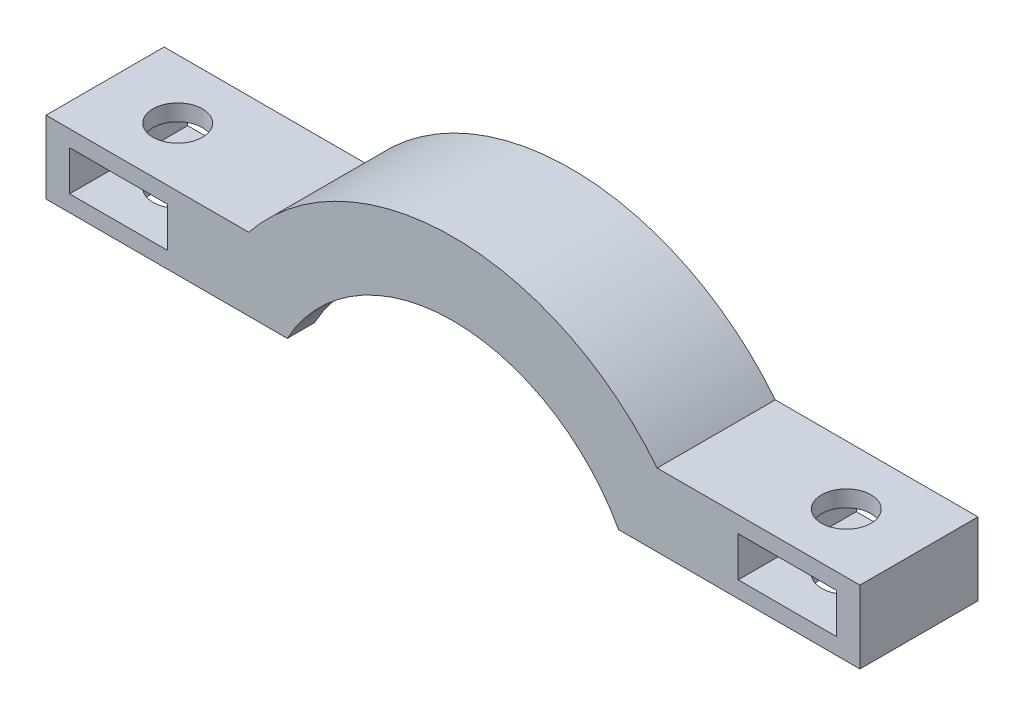
ISO-10303-21;
HEADER;
FILE_DESCRIPTION(('STEP AP214'),'2;1');
FILE_NAME('part.step','',(''),(''),'','','');
FILE_SCHEMA(('AUTOMOTIVE_DESIGN { 1 0 10303 214 1 1 1 1 }'));
ENDSEC;
DATA;
#1=APPLICATION_CONTEXT('core data for automotive mechanical design processes');
#2=APPLICATION_PROTOCOL_DEFINITION('international standard','automotive_design',2000,#1);
#3=PRODUCT_CONTEXT('',#1,'mechanical');
#4=PRODUCT('Part','Part','',(#3));
#5=PRODUCT_RELATED_PRODUCT_CATEGORY('part','',(#4));
#6=PRODUCT_DEFINITION_FORMATION('','',#4);
#7=PRODUCT_DEFINITION_CONTEXT('part definition',#1,'design');
#8=PRODUCT_DEFINITION('design','',#6,#7);
#9=PRODUCT_DEFINITION_SHAPE('','',#8);
#10=(LENGTH_UNIT() NAMED_UNIT(*) SI_UNIT(.MILLI.,.METRE.));
#11=(NAMED_UNIT(*) PLANE_ANGLE_UNIT() SI_UNIT($,.RADIAN.));
#12=(NAMED_UNIT(*) SI_UNIT($,.STERADIAN.) SOLID_ANGLE_UNIT());
#13=UNCERTAINTY_MEASURE_WITH_UNIT(LENGTH_MEASURE(1.E-05),#10,'distance_accuracy_value','');
#14=(GEOMETRIC_REPRESENTATION_CONTEXT(3) GLOBAL_UNCERTAINTY_ASSIGNED_CONTEXT((#13)) GLOBAL_UNIT_ASSIGNED_CONTEXT((#10,
#11,#12)) REPRESENTATION_CONTEXT('',''));
#15=CARTESIAN_POINT('',(0.,0.,0.));
#16=DIRECTION('',(0.,0.,1.));
#17=DIRECTION('',(1.,0.,0.));
#18=AXIS2_PLACEMENT_3D('',#15,#16,#17);
#19=CARTESIAN_POINT('',(0.,0.,15.748));
#20=DIRECTION('',(0.,0.,1.));
#21=DIRECTION('',(1.,0.,0.));
#22=AXIS2_PLACEMENT_3D('',#19,#20,#21);
#23=PLANE('',#22);
#24=DIRECTION('',(1.,0.,0.));
#25=VECTOR('',#24,1.);
#26=CARTESIAN_POINT('',(19.939,10.287,15.748));
#27=LINE('',#26,#25);
#28=CARTESIAN_POINT('',(19.939,10.287,15.748));
#29=VERTEX_POINT('',#28);
#30=CARTESIAN_POINT('',(26.797,10.287,15.748));
#31=VERTEX_POINT('',#30);
#32=EDGE_CURVE('E351',#29,#31,#27,.T.);
#33=ORIENTED_EDGE('',*,*,#32,.T.);
#34=DIRECTION('',(0.,-1.,0.));
#35=VECTOR('',#34,1.);
#36=CARTESIAN_POINT('',(26.797,10.287,15.748));
#37=LINE('',#36,#35);
#38=CARTESIAN_POINT('',(26.797,7.493,15.748));
#39=VERTEX_POINT('',#38);
#40=EDGE_CURVE('E348',#31,#39,#37,.T.);
#41=ORIENTED_EDGE('',*,*,#40,.T.);
#42=DIRECTION('',(-1.,0.,0.));
#43=VECTOR('',#42,1.);
#44=CARTESIAN_POINT('',(19.939,7.493,15.748));
#45=LINE('',#44,#43);
#46=CARTESIAN_POINT('',(19.939,7.493,15.748));
#47=VERTEX_POINT('',#46);
#48=EDGE_CURVE('E357',#39,#47,#45,.T.);
#49=ORIENTED_EDGE('',*,*,#48,.T.);
#50=DIRECTION('',(0.,1.,0.));
#51=VECTOR('',#50,1.);
#52=CARTESIAN_POINT('',(19.939,10.287,15.748));
#53=LINE('',#52,#51);
#54=EDGE_CURVE('E354',#47,#29,#53,.T.);
#55=ORIENTED_EDGE('',*,*,#54,.T.);
#56=EDGE_LOOP('',(#33,#41,#49,#55));
#57=FACE_BOUND('',#56,.T.);
#58=DIRECTION('',(0.,-1.,0.));
#59=VECTOR('',#58,1.);
#60=CARTESIAN_POINT('',(-26.797,10.287,15.748));
#61=LINE('',#60,#59);
#62=CARTESIAN_POINT('',(-26.797,10.287,15.748));
#63=VERTEX_POINT('',#62);
#64=CARTESIAN_POINT('',(-26.797,7.493,15.748));
#65=VERTEX_POINT('',#64);
#66=EDGE_CURVE('E305',#63,#65,#61,.T.);
#67=ORIENTED_EDGE('',*,*,#66,.F.);
#68=DIRECTION('',(-1.,0.,0.));
#69=VECTOR('',#68,1.);
#70=CARTESIAN_POINT('',(-19.939,10.287,15.748));
#71=LINE('',#70,#69);
#72=CARTESIAN_POINT('',(-19.939,10.287,15.748));
#73=VERTEX_POINT('',#72);
#74=EDGE_CURVE('E313',#73,#63,#71,.T.);
#75=ORIENTED_EDGE('',*,*,#74,.F.);
#76=DIRECTION('',(0.,1.,0.));
#77=VECTOR('',#76,1.);
#78=CARTESIAN_POINT('',(-19.939,10.287,15.748));
#79=LINE('',#78,#77);
#80=CARTESIAN_POINT('',(-19.939,7.493,15.748));
#81=VERTEX_POINT('',#80);
#82=EDGE_CURVE('E310',#81,#73,#79,.T.);
#83=ORIENTED_EDGE('',*,*,#82,.F.);
#84=DIRECTION('',(1.,0.,0.));
#85=VECTOR('',#84,1.);
#86=CARTESIAN_POINT('',(-19.939,7.493,15.748));
#87=LINE('',#86,#85);
#88=EDGE_CURVE('E307',#65,#81,#87,.T.);
#89=ORIENTED_EDGE('',*,*,#88,.F.);
#90=EDGE_LOOP('',(#67,#75,#83,#89));
#91=FACE_BOUND('',#90,.T.);
#92=DIRECTION('',(1.,0.,0.));
#93=VECTOR('',#92,1.);
#94=CARTESIAN_POINT('',(-28.448,6.35,15.748));
#95=LINE('',#94,#93);
#96=CARTESIAN_POINT('',(-28.448,6.35,15.748));
#97=VERTEX_POINT('',#96);
#98=CARTESIAN_POINT('',(-11.5813973250208,6.35,15.748));
#99=VERTEX_POINT('',#98);
#100=EDGE_CURVE('E191',#97,#99,#95,.T.);
#101=ORIENTED_EDGE('',*,*,#100,.T.);
#102=CARTESIAN_POINT('',(0.,0.,15.748));
#103=DIRECTION('',(0.,0.,1.));
#104=DIRECTION('',(1.,0.,0.));
#105=AXIS2_PLACEMENT_3D('',#102,#103,#104);
#106=CIRCLE('',#105,13.208);
#107=CARTESIAN_POINT('',(11.5813973250208,6.35,15.748));
#108=VERTEX_POINT('',#107);
#109=EDGE_CURVE('E212',#99,#108,#106,.F.);
#110=ORIENTED_EDGE('',*,*,#109,.T.);
#111=DIRECTION('',(-1.,0.,0.));
#112=VECTOR('',#111,1.);
#113=CARTESIAN_POINT('',(28.448,6.35,15.748));
#114=LINE('',#113,#112);
#115=CARTESIAN_POINT('',(28.448,6.35,15.748));
#116=VERTEX_POINT('',#115);
#117=EDGE_CURVE('E392',#116,#108,#114,.T.);
#118=ORIENTED_EDGE('',*,*,#117,.F.);
#119=DIRECTION('',(0.,-1.,0.));
#120=VECTOR('',#119,1.);
#121=CARTESIAN_POINT('',(28.448,11.43,15.748));
#122=LINE('',#121,#120);
#123=CARTESIAN_POINT('',(28.448,11.43,15.748));
#124=VERTEX_POINT('',#123);
#125=EDGE_CURVE('E376',#124,#116,#122,.T.);
#126=ORIENTED_EDGE('',*,*,#125,.F.);
#127=DIRECTION('',(-1.,0.,0.));
#128=VECTOR('',#127,1.);
#129=CARTESIAN_POINT('',(28.448,11.43,15.748));
#130=LINE('',#129,#128);
#131=CARTESIAN_POINT('',(14.2760654243387,11.43,15.748));
#132=VERTEX_POINT('',#131);
#133=EDGE_CURVE('E385',#124,#132,#130,.T.);
#134=ORIENTED_EDGE('',*,*,#133,.T.);
#135=CARTESIAN_POINT('',(0.,0.,15.748));
#136=DIRECTION('',(0.,0.,1.));
#137=DIRECTION('',(1.,0.,0.));
#138=AXIS2_PLACEMENT_3D('',#135,#136,#137);
#139=CIRCLE('',#138,18.288);
#140=CARTESIAN_POINT('',(-14.2760654243387,11.43,15.748));
#141=VERTEX_POINT('',#140);
#142=EDGE_CURVE('E208',#132,#141,#139,.T.);
#143=ORIENTED_EDGE('',*,*,#142,.T.);
#144=DIRECTION('',(1.,0.,0.));
#145=VECTOR('',#144,1.);
#146=CARTESIAN_POINT('',(-28.448,11.43,15.748));
#147=LINE('',#146,#145);
#148=CARTESIAN_POINT('',(-28.448,11.43,15.748));
#149=VERTEX_POINT('',#148);
#150=EDGE_CURVE('E346',#149,#141,#147,.T.);
#151=ORIENTED_EDGE('',*,*,#150,.F.);
#152=DIRECTION('',(0.,-1.,0.));
#153=VECTOR('',#152,1.);
#154=CARTESIAN_POINT('',(-28.448,11.43,15.748));
#155=LINE('',#154,#153);
#156=EDGE_CURVE('E334',#149,#97,#155,.T.);
#157=ORIENTED_EDGE('',*,*,#156,.T.);
#158=EDGE_LOOP('',(#101,#110,#118,#126,#134,#143,#151,#157));
#159=FACE_BOUND('',#158,.T.);
#160=ADVANCED_FACE('F39',(#57,#91,#159),#23,.T.);
#161=CARTESIAN_POINT('',(0.,0.,7.493));
#162=DIRECTION('',(0.,0.,1.));
#163=DIRECTION('',(1.,0.,0.));
#164=AXIS2_PLACEMENT_3D('',#161,#162,#163);
#165=PLANE('',#164);
#166=DIRECTION('',(0.,-1.,0.));
#167=VECTOR('',#166,1.);
#168=CARTESIAN_POINT('',(26.797,0.,7.493));
#169=LINE('',#168,#167);
#170=CARTESIAN_POINT('',(26.797,10.287,7.493));
#171=VERTEX_POINT('',#170);
#172=CARTESIAN_POINT('',(26.797,7.493,7.493));
#173=VERTEX_POINT('',#172);
#174=EDGE_CURVE('E236',#171,#173,#169,.T.);
#175=ORIENTED_EDGE('',*,*,#174,.F.);
#176=DIRECTION('',(1.,0.,0.));
#177=VECTOR('',#176,1.);
#178=CARTESIAN_POINT('',(0.,10.287,7.493));
#179=LINE('',#178,#177);
#180=CARTESIAN_POINT('',(19.939,10.287,7.493));
#181=VERTEX_POINT('',#180);
#182=EDGE_CURVE('E228',#181,#171,#179,.T.);
#183=ORIENTED_EDGE('',*,*,#182,.F.);
#184=DIRECTION('',(0.,1.,0.));
#185=VECTOR('',#184,1.);
#186=CARTESIAN_POINT('',(19.939,0.,7.493));
#187=LINE('',#186,#185);
#188=CARTESIAN_POINT('',(19.939,7.493,7.493));
#189=VERTEX_POINT('',#188);
#190=EDGE_CURVE('E219',#189,#181,#187,.T.);
#191=ORIENTED_EDGE('',*,*,#190,.F.);
#192=DIRECTION('',(-1.,0.,0.));
#193=VECTOR('',#192,1.);
#194=CARTESIAN_POINT('',(0.,7.493,7.493));
#195=LINE('',#194,#193);
#196=EDGE_CURVE('E233',#173,#189,#195,.T.);
#197=ORIENTED_EDGE('',*,*,#196,.F.);
#198=EDGE_LOOP('',(#175,#183,#191,#197));
#199=FACE_BOUND('',#198,.T.);
#200=DIRECTION('',(-1.,0.,0.));
#201=VECTOR('',#200,1.);
#202=CARTESIAN_POINT('',(0.,10.287,7.493));
#203=LINE('',#202,#201);
#204=CARTESIAN_POINT('',(-19.939,10.287,7.493));
#205=VERTEX_POINT('',#204);
#206=CARTESIAN_POINT('',(-26.797,10.287,7.493));
#207=VERTEX_POINT('',#206);
#208=EDGE_CURVE('E250',#205,#207,#203,.T.);
#209=ORIENTED_EDGE('',*,*,#208,.T.);
#210=DIRECTION('',(0.,-1.,0.));
#211=VECTOR('',#210,1.);
#212=CARTESIAN_POINT('',(-26.797,0.,7.493));
#213=LINE('',#212,#211);
#214=CARTESIAN_POINT('',(-26.797,7.493,7.493));
#215=VERTEX_POINT('',#214);
#216=EDGE_CURVE('E253',#207,#215,#213,.T.);
#217=ORIENTED_EDGE('',*,*,#216,.T.);
#218=DIRECTION('',(1.,0.,0.));
#219=VECTOR('',#218,1.);
#220=CARTESIAN_POINT('',(0.,7.493,7.493));
#221=LINE('',#220,#219);
#222=CARTESIAN_POINT('',(-19.939,7.493,7.493));
#223=VERTEX_POINT('',#222);
#224=EDGE_CURVE('E245',#215,#223,#221,.T.);
#225=ORIENTED_EDGE('',*,*,#224,.T.);
#226=DIRECTION('',(0.,1.,0.));
#227=VECTOR('',#226,1.);
#228=CARTESIAN_POINT('',(-19.939,0.,7.493));
#229=LINE('',#228,#227);
#230=EDGE_CURVE('E241',#223,#205,#229,.T.);
#231=ORIENTED_EDGE('',*,*,#230,.T.);
#232=EDGE_LOOP('',(#209,#217,#225,#231));
#233=FACE_BOUND('',#232,.T.);
#234=CARTESIAN_POINT('',(0.,0.,7.493));
#235=DIRECTION('',(0.,0.,1.));
#236=DIRECTION('',(1.,0.,0.));
#237=AXIS2_PLACEMENT_3D('',#234,#235,#236);
#238=CIRCLE('',#237,13.208);
#239=CARTESIAN_POINT('',(-11.5813973250208,6.35,7.493));
#240=VERTEX_POINT('',#239);
#241=CARTESIAN_POINT('',(11.5813973250208,6.35,7.493));
#242=VERTEX_POINT('',#241);
#243=EDGE_CURVE('E197',#240,#242,#238,.F.);
#244=ORIENTED_EDGE('',*,*,#243,.F.);
#245=DIRECTION('',(1.,0.,0.));
#246=VECTOR('',#245,1.);
#247=CARTESIAN_POINT('',(-28.448,6.35,7.493));
#248=LINE('',#247,#246);
#249=CARTESIAN_POINT('',(-28.448,6.35,7.493));
#250=VERTEX_POINT('',#249);
#251=EDGE_CURVE('E179',#250,#240,#248,.T.);
#252=ORIENTED_EDGE('',*,*,#251,.F.);
#253=DIRECTION('',(0.,1.,0.));
#254=VECTOR('',#253,1.);
#255=CARTESIAN_POINT('',(-28.448,11.43,7.493));
#256=LINE('',#255,#254);
#257=CARTESIAN_POINT('',(-28.448,11.43,7.493));
#258=VERTEX_POINT('',#257);
#259=EDGE_CURVE('E340',#250,#258,#256,.T.);
#260=ORIENTED_EDGE('',*,*,#259,.T.);
#261=DIRECTION('',(1.,0.,0.));
#262=VECTOR('',#261,1.);
#263=CARTESIAN_POINT('',(-28.448,11.43,7.493));
#264=LINE('',#263,#262);
#265=CARTESIAN_POINT('',(-14.2760654243387,11.43,7.493));
#266=VERTEX_POINT('',#265);
#267=EDGE_CURVE('E190',#258,#266,#264,.T.);
#268=ORIENTED_EDGE('',*,*,#267,.T.);
#269=CARTESIAN_POINT('',(0.,0.,7.493));
#270=DIRECTION('',(0.,0.,1.));
#271=DIRECTION('',(1.,0.,0.));
#272=AXIS2_PLACEMENT_3D('',#269,#270,#271);
#273=CIRCLE('',#272,18.288);
#274=CARTESIAN_POINT('',(14.2760654243387,11.43,7.493));
#275=VERTEX_POINT('',#274);
#276=EDGE_CURVE('E209',#266,#275,#273,.F.);
#277=ORIENTED_EDGE('',*,*,#276,.T.);
#278=DIRECTION('',(-1.,0.,0.));
#279=VECTOR('',#278,1.);
#280=CARTESIAN_POINT('',(28.448,11.43,7.493));
#281=LINE('',#280,#279);
#282=CARTESIAN_POINT('',(28.448,11.43,7.493));
#283=VERTEX_POINT('',#282);
#284=EDGE_CURVE('E388',#283,#275,#281,.T.);
#285=ORIENTED_EDGE('',*,*,#284,.F.);
#286=DIRECTION('',(0.,1.,0.));
#287=VECTOR('',#286,1.);
#288=CARTESIAN_POINT('',(28.448,11.43,7.493));
#289=LINE('',#288,#287);
#290=CARTESIAN_POINT('',(28.448,6.35,7.493));
#291=VERTEX_POINT('',#290);
#292=EDGE_CURVE('E381',#291,#283,#289,.T.);
#293=ORIENTED_EDGE('',*,*,#292,.F.);
#294=DIRECTION('',(-1.,0.,0.));
#295=VECTOR('',#294,1.);
#296=CARTESIAN_POINT('',(28.448,6.35,7.493));
#297=LINE('',#296,#295);
#298=EDGE_CURVE('E206',#291,#242,#297,.T.);
#299=ORIENTED_EDGE('',*,*,#298,.T.);
#300=EDGE_LOOP('',(#244,#252,#260,#268,#277,#285,#293,#299));
#301=FACE_BOUND('',#300,.T.);
#302=ADVANCED_FACE('F203',(#199,#233,#301),#165,.F.);
#303=CARTESIAN_POINT('',(0.,0.,0.));
#304=DIRECTION('',(0.,0.,1.));
#305=DIRECTION('',(1.,0.,0.));
#306=AXIS2_PLACEMENT_3D('',#303,#304,#305);
#307=CYLINDRICAL_SURFACE('',#306,13.208);
#308=DIRECTION('',(0.,0.,1.));
#309=VECTOR('',#308,1.);
#310=CARTESIAN_POINT('',(11.5813973250208,6.35,0.));
#311=LINE('',#310,#309);
#312=CARTESIAN_POINT('',(11.5813973250208,6.35,8.509));
#313=VERTEX_POINT('',#312);
#314=EDGE_CURVE('E291',#313,#242,#311,.F.);
#315=ORIENTED_EDGE('',*,*,#314,.F.);
#316=CARTESIAN_POINT('',(0.,0.,8.509));
#317=DIRECTION('',(0.,0.,1.));
#318=DIRECTION('',(1.,0.,0.));
#319=AXIS2_PLACEMENT_3D('',#316,#317,#318);
#320=CIRCLE('',#319,13.208);
#321=CARTESIAN_POINT('',(-11.5813973250208,6.35,8.509));
#322=VERTEX_POINT('',#321);
#323=EDGE_CURVE('E199',#322,#313,#320,.F.);
#324=ORIENTED_EDGE('',*,*,#323,.F.);
#325=DIRECTION('',(0.,0.,1.));
#326=VECTOR('',#325,1.);
#327=CARTESIAN_POINT('',(-11.5813973250208,6.35,0.));
#328=LINE('',#327,#326);
#329=EDGE_CURVE('E182',#240,#322,#328,.T.);
#330=ORIENTED_EDGE('',*,*,#329,.F.);
#331=ORIENTED_EDGE('',*,*,#243,.T.);
#332=EDGE_LOOP('',(#315,#324,#330,#331));
#333=FACE_BOUND('',#332,.T.);
#334=ADVANCED_FACE('F196',(#333),#307,.F.);
#335=DIRECTION('',(0.,0.,1.));
#336=VECTOR('',#335,1.);
#337=CARTESIAN_POINT('',(11.5813973250208,6.35,0.));
#338=LINE('',#337,#336);
#339=CARTESIAN_POINT('',(11.5813973250208,6.35,13.843));
#340=VERTEX_POINT('',#339);
#341=EDGE_CURVE('E296',#108,#340,#338,.F.);
#342=ORIENTED_EDGE('',*,*,#341,.F.);
#343=ORIENTED_EDGE('',*,*,#109,.F.);
#344=DIRECTION('',(0.,0.,1.));
#345=VECTOR('',#344,1.);
#346=CARTESIAN_POINT('',(-11.5813973250208,6.35,0.));
#347=LINE('',#346,#345);
#348=CARTESIAN_POINT('',(-11.5813973250208,6.35,13.843));
#349=VERTEX_POINT('',#348);
#350=EDGE_CURVE('E201',#349,#99,#347,.T.);
#351=ORIENTED_EDGE('',*,*,#350,.F.);
#352=CARTESIAN_POINT('',(0.,0.,13.843));
#353=DIRECTION('',(0.,0.,1.));
#354=DIRECTION('',(1.,0.,0.));
#355=AXIS2_PLACEMENT_3D('',#352,#353,#354);
#356=CIRCLE('',#355,13.208);
#357=EDGE_CURVE('E220',#349,#340,#356,.F.);
#358=ORIENTED_EDGE('',*,*,#357,.T.);
#359=EDGE_LOOP('',(#342,#343,#351,#358));
#360=FACE_BOUND('',#359,.T.);
#361=ADVANCED_FACE('F432',(#360),#307,.F.);
#362=CARTESIAN_POINT('',(0.,0.,8.509));
#363=DIRECTION('',(0.,0.,1.));
#364=DIRECTION('',(1.,0.,0.));
#365=AXIS2_PLACEMENT_3D('',#362,#363,#364);
#366=CYLINDRICAL_SURFACE('',#365,14.478);
#367=DIRECTION('',(0.,0.,1.));
#368=VECTOR('',#367,1.);
#369=CARTESIAN_POINT('',(-13.0111484504635,6.35,8.509));
#370=LINE('',#369,#368);
#371=CARTESIAN_POINT('',(-13.0111484504635,6.35,9.77899999999998));
#372=VERTEX_POINT('',#371);
#373=CARTESIAN_POINT('',(-13.0111484504635,6.35,12.573));
#374=VERTEX_POINT('',#373);
#375=EDGE_CURVE('E200',#372,#374,#370,.T.);
#376=ORIENTED_EDGE('',*,*,#375,.F.);
#377=CARTESIAN_POINT('',(0.,0.,9.77899999999998));
#378=DIRECTION('',(0.,0.,1.));
#379=DIRECTION('',(1.,0.,0.));
#380=AXIS2_PLACEMENT_3D('',#377,#378,#379);
#381=CIRCLE('',#380,14.478);
#382=CARTESIAN_POINT('',(13.0111484504635,6.35,9.77899999999998));
#383=VERTEX_POINT('',#382);
#384=EDGE_CURVE('E258',#372,#383,#381,.F.);
#385=ORIENTED_EDGE('',*,*,#384,.T.);
#386=DIRECTION('',(0.,0.,1.));
#387=VECTOR('',#386,1.);
#388=CARTESIAN_POINT('',(13.0111484504635,6.35,8.509));
#389=LINE('',#388,#387);
#390=CARTESIAN_POINT('',(13.0111484504635,6.35,12.573));
#391=VERTEX_POINT('',#390);
#392=EDGE_CURVE('E293',#391,#383,#389,.F.);
#393=ORIENTED_EDGE('',*,*,#392,.F.);
#394=CARTESIAN_POINT('',(0.,0.,12.573));
#395=DIRECTION('',(0.,0.,1.));
#396=DIRECTION('',(1.,0.,0.));
#397=AXIS2_PLACEMENT_3D('',#394,#395,#396);
#398=CIRCLE('',#397,14.478);
#399=EDGE_CURVE('E256',#391,#374,#398,.T.);
#400=ORIENTED_EDGE('',*,*,#399,.T.);
#401=EDGE_LOOP('',(#376,#385,#393,#400));
#402=FACE_BOUND('',#401,.T.);
#403=ADVANCED_FACE('F299',(#402),#366,.F.);
#404=CARTESIAN_POINT('',(-23.368,-11.43,11.6205));
#405=DIRECTION('',(0.,-1.,0.));
#406=DIRECTION('',(0.,0.,-1.));
#407=AXIS2_PLACEMENT_3D('',#404,#405,#406);
#408=CYLINDRICAL_SURFACE('',#407,1.72719999999999);
#409=CARTESIAN_POINT('',(-23.368,10.287,11.6205));
#410=DIRECTION('',(0.,1.,0.));
#411=DIRECTION('',(0.,0.,1.));
#412=AXIS2_PLACEMENT_3D('',#409,#410,#411);
#413=CIRCLE('',#412,1.72719999999999);
#414=CARTESIAN_POINT('',(-23.368,10.287,13.3477));
#415=VERTEX_POINT('',#414);
#416=EDGE_CURVE('E247',#415,#415,#413,.F.);
#417=ORIENTED_EDGE('',*,*,#416,.T.);
#418=EDGE_LOOP('',(#417));
#419=FACE_BOUND('',#418,.T.);
#420=CARTESIAN_POINT('',(-23.368,11.43,11.6205));
#421=DIRECTION('',(0.,1.,0.));
#422=DIRECTION('',(0.,0.,1.));
#423=AXIS2_PLACEMENT_3D('',#420,#421,#422);
#424=CIRCLE('',#423,1.72719999999999);
#425=CARTESIAN_POINT('',(-23.368,11.43,13.3477));
#426=VERTEX_POINT('',#425);
#427=EDGE_CURVE('E331',#426,#426,#424,.T.);
#428=ORIENTED_EDGE('',*,*,#427,.T.);
#429=EDGE_LOOP('',(#428));
#430=FACE_BOUND('',#429,.T.);
#431=ADVANCED_FACE('F419',(#419,#430),#408,.F.);
#432=CARTESIAN_POINT('',(0.,0.,19.05));
#433=DIRECTION('',(0.,0.,-1.));
#434=DIRECTION('',(-1.,0.,0.));
#435=AXIS2_PLACEMENT_3D('',#432,#433,#434);
#436=CYLINDRICAL_SURFACE('',#435,18.288);
#437=ORIENTED_EDGE('',*,*,#276,.F.);
#438=DIRECTION('',(0.,0.,-1.));
#439=VECTOR('',#438,1.);
#440=CARTESIAN_POINT('',(-14.2760654243387,11.43,19.05));
#441=LINE('',#440,#439);
#442=EDGE_CURVE('E238',#266,#141,#441,.F.);
#443=ORIENTED_EDGE('',*,*,#442,.T.);
#444=ORIENTED_EDGE('',*,*,#142,.F.);
#445=DIRECTION('',(0.,0.,-1.));
#446=VECTOR('',#445,1.);
#447=CARTESIAN_POINT('',(14.2760654243387,11.43,19.05));
#448=LINE('',#447,#446);
#449=EDGE_CURVE('E223',#275,#132,#448,.F.);
#450=ORIENTED_EDGE('',*,*,#449,.F.);
#451=EDGE_LOOP('',(#437,#443,#444,#450));
#452=FACE_BOUND('',#451,.T.);
#453=ADVANCED_FACE('F407',(#452),#436,.T.);
#454=CARTESIAN_POINT('',(23.368,-11.43,11.6205));
#455=DIRECTION('',(0.,-1.,0.));
#456=DIRECTION('',(0.,0.,-1.));
#457=AXIS2_PLACEMENT_3D('',#454,#455,#456);
#458=CYLINDRICAL_SURFACE('',#457,1.72719999999999);
#459=CARTESIAN_POINT('',(23.368,6.35,11.6205));
#460=DIRECTION('',(0.,1.,0.));
#461=DIRECTION('',(0.,0.,1.));
#462=AXIS2_PLACEMENT_3D('',#459,#460,#461);
#463=CIRCLE('',#462,1.72719999999999);
#464=CARTESIAN_POINT('',(23.368,6.35,13.3477));
#465=VERTEX_POINT('',#464);
#466=EDGE_CURVE('E373',#465,#465,#463,.T.);
#467=ORIENTED_EDGE('',*,*,#466,.F.);
#468=EDGE_LOOP('',(#467));
#469=FACE_BOUND('',#468,.T.);
#470=CARTESIAN_POINT('',(23.368,7.493,11.6205));
#471=DIRECTION('',(0.,1.,0.));
#472=DIRECTION('',(0.,0.,1.));
#473=AXIS2_PLACEMENT_3D('',#470,#471,#472);
#474=CIRCLE('',#473,1.72719999999999);
#475=CARTESIAN_POINT('',(23.368,7.493,13.3477));
#476=VERTEX_POINT('',#475);
#477=EDGE_CURVE('E230',#476,#476,#474,.F.);
#478=ORIENTED_EDGE('',*,*,#477,.F.);
#479=EDGE_LOOP('',(#478));
#480=FACE_BOUND('',#479,.T.);
#481=ADVANCED_FACE('F434',(#469,#480),#458,.F.);
#482=CARTESIAN_POINT('',(23.368,11.43,11.6205));
#483=DIRECTION('',(0.,-1.,0.));
#484=DIRECTION('',(0.,0.,-1.));
#485=AXIS2_PLACEMENT_3D('',#482,#483,#484);
#486=CIRCLE('',#485,1.72719999999999);
#487=CARTESIAN_POINT('',(23.368,11.43,9.89330000000001));
#488=VERTEX_POINT('',#487);
#489=EDGE_CURVE('E370',#488,#488,#486,.T.);
#490=ORIENTED_EDGE('',*,*,#489,.F.);
#491=EDGE_LOOP('',(#490));
#492=FACE_BOUND('',#491,.T.);
#493=CARTESIAN_POINT('',(23.368,10.287,11.6205));
#494=DIRECTION('',(0.,-1.,0.));
#495=DIRECTION('',(0.,0.,-1.));
#496=AXIS2_PLACEMENT_3D('',#493,#494,#495);
#497=CIRCLE('',#496,1.72719999999999);
#498=CARTESIAN_POINT('',(23.368,10.287,9.89330000000001));
#499=VERTEX_POINT('',#498);
#500=EDGE_CURVE('E225',#499,#499,#497,.F.);
#501=ORIENTED_EDGE('',*,*,#500,.F.);
#502=EDGE_LOOP('',(#501));
#503=FACE_BOUND('',#502,.T.);
#504=ADVANCED_FACE('F439',(#492,#503),#458,.F.);
#505=CARTESIAN_POINT('',(28.448,6.35,15.748));
#506=DIRECTION('',(0.,1.,0.));
#507=DIRECTION('',(0.,0.,1.));
#508=AXIS2_PLACEMENT_3D('',#505,#506,#507);
#509=PLANE('',#508);
#510=ORIENTED_EDGE('',*,*,#466,.T.);
#511=EDGE_LOOP('',(#510));
#512=FACE_BOUND('',#511,.T.);
#513=ORIENTED_EDGE('',*,*,#117,.T.);
#514=ORIENTED_EDGE('',*,*,#341,.T.);
#515=CARTESIAN_POINT('',(11.5813973250208,6.35,13.843));
#516=CARTESIAN_POINT('',(11.7012211250562,6.35,13.7379318645128));
#517=CARTESIAN_POINT('',(11.820858961763,6.35,13.6326518659382));
#518=CARTESIAN_POINT('',(12.0597870006911,6.35,13.4217003327664));
#519=CARTESIAN_POINT('',(12.1790772061292,6.35,13.316028801813));
#520=CARTESIAN_POINT('',(12.4173363545556,6.35,13.1043245699924));
#521=CARTESIAN_POINT('',(12.5363052979314,6.35,12.9982918695613));
#522=CARTESIAN_POINT('',(12.7739451674041,6.35,12.785890795463));
#523=CARTESIAN_POINT('',(12.8926160907248,6.35,12.6795224186894));
#524=CARTESIAN_POINT('',(13.0111484504635,6.35,12.573));
#525=B_SPLINE_CURVE_WITH_KNOTS('',3,(#515,#516,#517,#518,#519,#520,#521,#522,#523,#524),
.UNSPECIFIED.,.F.,.F.,(4,2,2,2,4),(0.,0.478093160569273,0.956181883001008,1.43427002817115,
1.91236261042403),.UNSPECIFIED.);
#526=EDGE_CURVE('E12',#340,#391,#525,.T.);
#527=ORIENTED_EDGE('',*,*,#526,.T.);
#528=ORIENTED_EDGE('',*,*,#392,.T.);
#529=CARTESIAN_POINT('',(13.0111484504635,6.35,9.77899999999998));
#530=CARTESIAN_POINT('',(12.8926160907248,6.35,9.67247758131059));
#531=CARTESIAN_POINT('',(12.7739451674041,6.35,9.56610920453702));
#532=CARTESIAN_POINT('',(12.5363052979315,6.35,9.35370813043864));
#533=CARTESIAN_POINT('',(12.4173363545556,6.35,9.24767543000762));
#534=CARTESIAN_POINT('',(12.1790772061292,6.35,9.03597119818696));
#535=CARTESIAN_POINT('',(12.0597870006911,6.35,8.93029966723355));
#536=CARTESIAN_POINT('',(11.820858961763,6.35,8.71934813406183));
#537=CARTESIAN_POINT('',(11.7012211250562,6.35,8.61406813548722));
#538=CARTESIAN_POINT('',(11.5813973250209,6.35,8.509));
#539=B_SPLINE_CURVE_WITH_KNOTS('',3,(#529,#530,#531,#532,#533,#534,#535,#536,#537,#538),
.UNSPECIFIED.,.F.,.F.,(4,2,2,2,4),(0.,0.478092582252872,0.956180727423011,1.43426944985474,
1.91236261042401),.UNSPECIFIED.);
#540=EDGE_CURVE('E265',#383,#313,#539,.T.);
#541=ORIENTED_EDGE('',*,*,#540,.T.);
#542=ORIENTED_EDGE('',*,*,#314,.T.);
#543=ORIENTED_EDGE('',*,*,#298,.F.);
#544=DIRECTION('',(0.,0.,-1.));
#545=VECTOR('',#544,1.);
#546=CARTESIAN_POINT('',(28.448,6.35,15.748));
#547=LINE('',#546,#545);
#548=EDGE_CURVE('E379',#116,#291,#547,.T.);
#549=ORIENTED_EDGE('',*,*,#548,.F.);
#550=EDGE_LOOP('',(#513,#514,#527,#528,#541,#542,#543,#549));
#551=FACE_BOUND('',#550,.T.);
#552=ADVANCED_FACE('F290',(#512,#551),#509,.F.);
#553=CARTESIAN_POINT('',(28.448,11.43,15.748));
#554=DIRECTION('',(0.,-1.,0.));
#555=DIRECTION('',(0.,0.,-1.));
#556=AXIS2_PLACEMENT_3D('',#553,#554,#555);
#557=PLANE('',#556);
#558=ORIENTED_EDGE('',*,*,#489,.T.);
#559=EDGE_LOOP('',(#558));
#560=FACE_BOUND('',#559,.T.);
#561=ORIENTED_EDGE('',*,*,#284,.T.);
#562=ORIENTED_EDGE('',*,*,#449,.T.);
#563=ORIENTED_EDGE('',*,*,#133,.F.);
#564=DIRECTION('',(0.,0.,1.));
#565=VECTOR('',#564,1.);
#566=CARTESIAN_POINT('',(28.448,11.43,15.748));
#567=LINE('',#566,#565);
#568=EDGE_CURVE('E383',#283,#124,#567,.T.);
#569=ORIENTED_EDGE('',*,*,#568,.F.);
#570=EDGE_LOOP('',(#561,#562,#563,#569));
#571=FACE_BOUND('',#570,.T.);
#572=ADVANCED_FACE('F397',(#560,#571),#557,.F.);
#573=CARTESIAN_POINT('',(28.448,0.,0.));
#574=DIRECTION('',(1.,0.,0.));
#575=DIRECTION('',(0.,0.,-1.));
#576=AXIS2_PLACEMENT_3D('',#573,#574,#575);
#577=PLANE('',#576);
#578=ORIENTED_EDGE('',*,*,#125,.T.);
#579=ORIENTED_EDGE('',*,*,#548,.T.);
#580=ORIENTED_EDGE('',*,*,#292,.T.);
#581=ORIENTED_EDGE('',*,*,#568,.T.);
#582=EDGE_LOOP('',(#578,#579,#580,#581));
#583=FACE_BOUND('',#582,.T.);
#584=ADVANCED_FACE('F406',(#583),#577,.T.);
#585=CARTESIAN_POINT('',(26.797,10.287,4.953));
#586=DIRECTION('',(-1.,0.,0.));
#587=DIRECTION('',(0.,0.,1.));
#588=AXIS2_PLACEMENT_3D('',#585,#586,#587);
#589=PLANE('',#588);
#590=ORIENTED_EDGE('',*,*,#174,.T.);
#591=DIRECTION('',(0.,0.,1.));
#592=VECTOR('',#591,1.);
#593=CARTESIAN_POINT('',(26.797,7.493,4.953));
#594=LINE('',#593,#592);
#595=EDGE_CURVE('E229',#173,#39,#594,.T.);
#596=ORIENTED_EDGE('',*,*,#595,.T.);
#597=ORIENTED_EDGE('',*,*,#40,.F.);
#598=DIRECTION('',(0.,0.,1.));
#599=VECTOR('',#598,1.);
#600=CARTESIAN_POINT('',(26.797,10.287,4.953));
#601=LINE('',#600,#599);
#602=EDGE_CURVE('E360',#171,#31,#601,.T.);
#603=ORIENTED_EDGE('',*,*,#602,.F.);
#604=EDGE_LOOP('',(#590,#596,#597,#603));
#605=FACE_BOUND('',#604,.T.);
#606=ADVANCED_FACE('F616',(#605),#589,.T.);
#607=CARTESIAN_POINT('',(19.939,10.287,4.953));
#608=DIRECTION('',(1.,0.,0.));
#609=DIRECTION('',(0.,0.,-1.));
#610=AXIS2_PLACEMENT_3D('',#607,#608,#609);
#611=PLANE('',#610);
#612=ORIENTED_EDGE('',*,*,#190,.T.);
#613=DIRECTION('',(0.,0.,1.));
#614=VECTOR('',#613,1.);
#615=CARTESIAN_POINT('',(19.939,10.287,4.953));
#616=LINE('',#615,#614);
#617=EDGE_CURVE('E364',#181,#29,#616,.T.);
#618=ORIENTED_EDGE('',*,*,#617,.T.);
#619=ORIENTED_EDGE('',*,*,#54,.F.);
#620=DIRECTION('',(0.,0.,1.));
#621=VECTOR('',#620,1.);
#622=CARTESIAN_POINT('',(19.939,7.493,4.953));
#623=LINE('',#622,#621);
#624=EDGE_CURVE('E362',#189,#47,#623,.T.);
#625=ORIENTED_EDGE('',*,*,#624,.F.);
#626=EDGE_LOOP('',(#612,#618,#619,#625));
#627=FACE_BOUND('',#626,.T.);
#628=ADVANCED_FACE('F608',(#627),#611,.T.);
#629=CARTESIAN_POINT('',(19.939,7.493,4.953));
#630=DIRECTION('',(0.,1.,0.));
#631=DIRECTION('',(0.,0.,1.));
#632=AXIS2_PLACEMENT_3D('',#629,#630,#631);
#633=PLANE('',#632);
#634=ORIENTED_EDGE('',*,*,#477,.T.);
#635=EDGE_LOOP('',(#634));
#636=FACE_BOUND('',#635,.T.);
#637=ORIENTED_EDGE('',*,*,#196,.T.);
#638=ORIENTED_EDGE('',*,*,#624,.T.);
#639=ORIENTED_EDGE('',*,*,#48,.F.);
#640=ORIENTED_EDGE('',*,*,#595,.F.);
#641=EDGE_LOOP('',(#637,#638,#639,#640));
#642=FACE_BOUND('',#641,.T.);
#643=ADVANCED_FACE('F599',(#636,#642),#633,.T.);
#644=CARTESIAN_POINT('',(19.939,10.287,4.953));
#645=DIRECTION('',(0.,-1.,0.));
#646=DIRECTION('',(0.,0.,-1.));
#647=AXIS2_PLACEMENT_3D('',#644,#645,#646);
#648=PLANE('',#647);
#649=ORIENTED_EDGE('',*,*,#500,.T.);
#650=EDGE_LOOP('',(#649));
#651=FACE_BOUND('',#650,.T.);
#652=ORIENTED_EDGE('',*,*,#182,.T.);
#653=ORIENTED_EDGE('',*,*,#602,.T.);
#654=ORIENTED_EDGE('',*,*,#32,.F.);
#655=ORIENTED_EDGE('',*,*,#617,.F.);
#656=EDGE_LOOP('',(#652,#653,#654,#655));
#657=FACE_BOUND('',#656,.T.);
#658=ADVANCED_FACE('F585',(#651,#657),#648,.T.);
#659=CARTESIAN_POINT('',(-28.448,11.43,15.748));
#660=DIRECTION('',(0.,1.,0.));
#661=DIRECTION('',(0.,0.,1.));
#662=AXIS2_PLACEMENT_3D('',#659,#660,#661);
#663=PLANE('',#662);
#664=ORIENTED_EDGE('',*,*,#427,.F.);
#665=EDGE_LOOP('',(#664));
#666=FACE_BOUND('',#665,.T.);
#667=ORIENTED_EDGE('',*,*,#442,.F.);
#668=ORIENTED_EDGE('',*,*,#267,.F.);
#669=DIRECTION('',(0.,0.,1.));
#670=VECTOR('',#669,1.);
#671=CARTESIAN_POINT('',(-28.448,11.43,15.748));
#672=LINE('',#671,#670);
#673=EDGE_CURVE('E337',#258,#149,#672,.T.);
#674=ORIENTED_EDGE('',*,*,#673,.T.);
#675=ORIENTED_EDGE('',*,*,#150,.T.);
#676=EDGE_LOOP('',(#667,#668,#674,#675));
#677=FACE_BOUND('',#676,.T.);
#678=ADVANCED_FACE('F277',(#666,#677),#663,.T.);
#679=CARTESIAN_POINT('',(-28.448,6.35,15.748));
#680=DIRECTION('',(0.,-1.,0.));
#681=DIRECTION('',(0.,0.,-1.));
#682=AXIS2_PLACEMENT_3D('',#679,#680,#681);
#683=PLANE('',#682);
#684=CARTESIAN_POINT('',(-23.368,6.35,11.6205));
#685=DIRECTION('',(0.,-1.,0.));
#686=DIRECTION('',(0.,0.,-1.));
#687=AXIS2_PLACEMENT_3D('',#684,#685,#686);
#688=CIRCLE('',#687,1.72719999999999);
#689=CARTESIAN_POINT('',(-23.368,6.35,9.89330000000001));
#690=VERTEX_POINT('',#689);
#691=EDGE_CURVE('E328',#690,#690,#688,.T.);
#692=ORIENTED_EDGE('',*,*,#691,.F.);
#693=EDGE_LOOP('',(#692));
#694=FACE_BOUND('',#693,.T.);
#695=ORIENTED_EDGE('',*,*,#251,.T.);
#696=ORIENTED_EDGE('',*,*,#329,.T.);
#697=CARTESIAN_POINT('',(-11.5813973250209,6.35,8.509));
#698=CARTESIAN_POINT('',(-11.7012211250562,6.35,8.61406813548722));
#699=CARTESIAN_POINT('',(-11.820858961763,6.35,8.71934813406183));
#700=CARTESIAN_POINT('',(-12.0597870006911,6.35,8.93029966723355));
#701=CARTESIAN_POINT('',(-12.1790772061292,6.35,9.03597119818696));
#702=CARTESIAN_POINT('',(-12.4173363545556,6.35,9.24767543000762));
#703=CARTESIAN_POINT('',(-12.5363052979314,6.35,9.35370813043863));
#704=CARTESIAN_POINT('',(-12.7739451674041,6.35,9.56610920453701));
#705=CARTESIAN_POINT('',(-12.8926160907248,6.35,9.67247758131059));
#706=CARTESIAN_POINT('',(-13.0111484504635,6.35,9.77899999999998));
#707=B_SPLINE_CURVE_WITH_KNOTS('',3,(#697,#698,#699,#700,#701,#702,#703,#704,#705,#706),
.UNSPECIFIED.,.F.,.F.,(4,2,2,2,4),(0.,0.478093160569269,0.956181883000996,1.43427002817113,
1.91236261042401),.UNSPECIFIED.);
#708=EDGE_CURVE('E66',#322,#372,#707,.T.);
#709=ORIENTED_EDGE('',*,*,#708,.T.);
#710=ORIENTED_EDGE('',*,*,#375,.T.);
#711=CARTESIAN_POINT('',(-13.0111484504635,6.35,12.573));
#712=CARTESIAN_POINT('',(-12.8926160907248,6.35,12.6795224186894));
#713=CARTESIAN_POINT('',(-12.7739451674041,6.35,12.785890795463));
#714=CARTESIAN_POINT('',(-12.5363052979315,6.35,12.9982918695613));
#715=CARTESIAN_POINT('',(-12.4173363545556,6.35,13.1043245699924));
#716=CARTESIAN_POINT('',(-12.1790772061292,6.35,13.316028801813));
#717=CARTESIAN_POINT('',(-12.0597870006911,6.35,13.4217003327664));
#718=CARTESIAN_POINT('',(-11.820858961763,6.35,13.6326518659382));
#719=CARTESIAN_POINT('',(-11.7012211250562,6.35,13.7379318645128));
#720=CARTESIAN_POINT('',(-11.5813973250208,6.35,13.843));
#721=B_SPLINE_CURVE_WITH_KNOTS('',3,(#711,#712,#713,#714,#715,#716,#717,#718,#719,#720),
.UNSPECIFIED.,.F.,.F.,(4,2,2,2,4),(0.,0.478092582252877,0.956180727423021,1.43426944985476,
1.91236261042403),.UNSPECIFIED.);
#722=EDGE_CURVE('E52',#374,#349,#721,.T.);
#723=ORIENTED_EDGE('',*,*,#722,.T.);
#724=ORIENTED_EDGE('',*,*,#350,.T.);
#725=ORIENTED_EDGE('',*,*,#100,.F.);
#726=DIRECTION('',(0.,0.,-1.));
#727=VECTOR('',#726,1.);
#728=CARTESIAN_POINT('',(-28.448,6.35,15.748));
#729=LINE('',#728,#727);
#730=EDGE_CURVE('E185',#97,#250,#729,.T.);
#731=ORIENTED_EDGE('',*,*,#730,.T.);
#732=EDGE_LOOP('',(#695,#696,#709,#710,#723,#724,#725,#731));
#733=FACE_BOUND('',#732,.T.);
#734=ADVANCED_FACE('F181',(#694,#733),#683,.T.);
#735=CARTESIAN_POINT('',(-28.448,0.,0.));
#736=DIRECTION('',(-1.,0.,0.));
#737=DIRECTION('',(0.,0.,-1.));
#738=AXIS2_PLACEMENT_3D('',#735,#736,#737);
#739=PLANE('',#738);
#740=ORIENTED_EDGE('',*,*,#156,.F.);
#741=ORIENTED_EDGE('',*,*,#673,.F.);
#742=ORIENTED_EDGE('',*,*,#259,.F.);
#743=ORIENTED_EDGE('',*,*,#730,.F.);
#744=EDGE_LOOP('',(#740,#741,#742,#743));
#745=FACE_BOUND('',#744,.T.);
#746=ADVANCED_FACE('F276',(#745),#739,.T.);
#747=CARTESIAN_POINT('',(-23.368,7.493,11.6205));
#748=DIRECTION('',(0.,-1.,0.));
#749=DIRECTION('',(0.,0.,-1.));
#750=AXIS2_PLACEMENT_3D('',#747,#748,#749);
#751=CIRCLE('',#750,1.72719999999999);
#752=CARTESIAN_POINT('',(-23.368,7.493,9.89330000000001));
#753=VERTEX_POINT('',#752);
#754=EDGE_CURVE('E242',#753,#753,#751,.F.);
#755=ORIENTED_EDGE('',*,*,#754,.T.);
#756=EDGE_LOOP('',(#755));
#757=FACE_BOUND('',#756,.T.);
#758=ORIENTED_EDGE('',*,*,#691,.T.);
#759=EDGE_LOOP('',(#758));
#760=FACE_BOUND('',#759,.T.);
#761=ADVANCED_FACE('F413',(#757,#760),#408,.F.);
#762=CARTESIAN_POINT('',(-26.797,10.287,4.953));
#763=DIRECTION('',(-1.,0.,0.));
#764=DIRECTION('',(0.,0.,1.));
#765=AXIS2_PLACEMENT_3D('',#762,#763,#764);
#766=PLANE('',#765);
#767=DIRECTION('',(0.,0.,1.));
#768=VECTOR('',#767,1.);
#769=CARTESIAN_POINT('',(-26.797,10.287,4.953));
#770=LINE('',#769,#768);
#771=EDGE_CURVE('E246',#207,#63,#770,.T.);
#772=ORIENTED_EDGE('',*,*,#771,.T.);
#773=ORIENTED_EDGE('',*,*,#66,.T.);
#774=DIRECTION('',(0.,0.,1.));
#775=VECTOR('',#774,1.);
#776=CARTESIAN_POINT('',(-26.797,7.493,4.953));
#777=LINE('',#776,#775);
#778=EDGE_CURVE('E316',#215,#65,#777,.T.);
#779=ORIENTED_EDGE('',*,*,#778,.F.);
#780=ORIENTED_EDGE('',*,*,#216,.F.);
#781=EDGE_LOOP('',(#772,#773,#779,#780));
#782=FACE_BOUND('',#781,.T.);
#783=ADVANCED_FACE('F417',(#782),#766,.F.);
#784=CARTESIAN_POINT('',(-19.939,10.287,4.953));
#785=DIRECTION('',(1.,0.,0.));
#786=DIRECTION('',(0.,0.,-1.));
#787=AXIS2_PLACEMENT_3D('',#784,#785,#786);
#788=PLANE('',#787);
#789=DIRECTION('',(0.,0.,1.));
#790=VECTOR('',#789,1.);
#791=CARTESIAN_POINT('',(-19.939,7.493,4.953));
#792=LINE('',#791,#790);
#793=EDGE_CURVE('E320',#223,#81,#792,.T.);
#794=ORIENTED_EDGE('',*,*,#793,.T.);
#795=ORIENTED_EDGE('',*,*,#82,.T.);
#796=DIRECTION('',(0.,0.,1.));
#797=VECTOR('',#796,1.);
#798=CARTESIAN_POINT('',(-19.939,10.287,4.953));
#799=LINE('',#798,#797);
#800=EDGE_CURVE('E318',#205,#73,#799,.T.);
#801=ORIENTED_EDGE('',*,*,#800,.F.);
#802=ORIENTED_EDGE('',*,*,#230,.F.);
#803=EDGE_LOOP('',(#794,#795,#801,#802));
#804=FACE_BOUND('',#803,.T.);
#805=ADVANCED_FACE('F450',(#804),#788,.F.);
#806=CARTESIAN_POINT('',(-19.939,10.287,4.953));
#807=DIRECTION('',(0.,1.,0.));
#808=DIRECTION('',(0.,0.,1.));
#809=AXIS2_PLACEMENT_3D('',#806,#807,#808);
#810=PLANE('',#809);
#811=ORIENTED_EDGE('',*,*,#416,.F.);
#812=EDGE_LOOP('',(#811));
#813=FACE_BOUND('',#812,.T.);
#814=ORIENTED_EDGE('',*,*,#800,.T.);
#815=ORIENTED_EDGE('',*,*,#74,.T.);
#816=ORIENTED_EDGE('',*,*,#771,.F.);
#817=ORIENTED_EDGE('',*,*,#208,.F.);
#818=EDGE_LOOP('',(#814,#815,#816,#817));
#819=FACE_BOUND('',#818,.T.);
#820=ADVANCED_FACE('F455',(#813,#819),#810,.F.);
#821=CARTESIAN_POINT('',(-19.939,7.493,4.953));
#822=DIRECTION('',(0.,-1.,0.));
#823=DIRECTION('',(0.,0.,-1.));
#824=AXIS2_PLACEMENT_3D('',#821,#822,#823);
#825=PLANE('',#824);
#826=ORIENTED_EDGE('',*,*,#754,.F.);
#827=EDGE_LOOP('',(#826));
#828=FACE_BOUND('',#827,.T.);
#829=ORIENTED_EDGE('',*,*,#778,.T.);
#830=ORIENTED_EDGE('',*,*,#88,.T.);
#831=ORIENTED_EDGE('',*,*,#793,.F.);
#832=ORIENTED_EDGE('',*,*,#224,.F.);
#833=EDGE_LOOP('',(#829,#830,#831,#832));
#834=FACE_BOUND('',#833,.T.);
#835=ADVANCED_FACE('F452',(#828,#834),#825,.F.);
#836=CARTESIAN_POINT('',(0.,0.,8.509));
#837=DIRECTION('',(0.,0.,1.));
#838=DIRECTION('',(1.,0.,0.));
#839=AXIS2_PLACEMENT_3D('',#836,#837,#838);
#840=CONICAL_SURFACE('',#839,13.208,0.785398163397454);
#841=ORIENTED_EDGE('',*,*,#540,.F.);
#842=ORIENTED_EDGE('',*,*,#384,.F.);
#843=ORIENTED_EDGE('',*,*,#708,.F.);
#844=ORIENTED_EDGE('',*,*,#323,.T.);
#845=EDGE_LOOP('',(#841,#842,#843,#844));
#846=FACE_BOUND('',#845,.T.);
#847=ADVANCED_FACE('F269',(#846),#840,.F.);
#848=CARTESIAN_POINT('',(0.,0.,12.573));
#849=DIRECTION('',(0.,0.,-1.));
#850=DIRECTION('',(-1.,0.,0.));
#851=AXIS2_PLACEMENT_3D('',#848,#849,#850);
#852=CONICAL_SURFACE('',#851,14.478,0.785398163397444);
#853=ORIENTED_EDGE('',*,*,#526,.F.);
#854=ORIENTED_EDGE('',*,*,#357,.F.);
#855=ORIENTED_EDGE('',*,*,#722,.F.);
#856=ORIENTED_EDGE('',*,*,#399,.F.);
#857=EDGE_LOOP('',(#853,#854,#855,#856));
#858=FACE_BOUND('',#857,.T.);
#859=ADVANCED_FACE('F41',(#858),#852,.F.);
#860=CLOSED_SHELL('',(#160,#302,#334,#361,#403,#431,#453,#481,#504,#552,#572,#584,#606,#628,
#643,#658,#678,#734,#746,#761,#783,#805,#820,#835,#847,#859));
#861=MANIFOLD_SOLID_BREP('B2',#860);
#862=ADVANCED_BREP_SHAPE_REPRESENTATION('',(#18,#861),#14);
#863=SHAPE_DEFINITION_REPRESENTATION(#9,#862);
ENDSEC;
END-ISO-10303-21;
